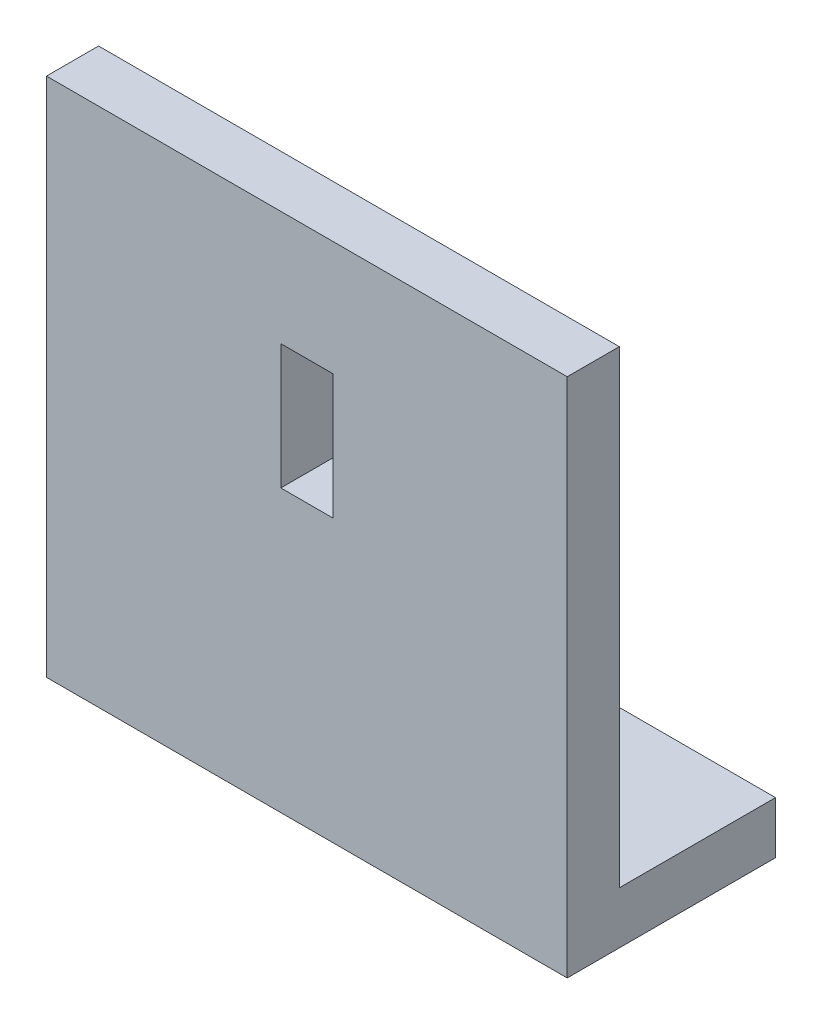
ISO-10303-21;
HEADER;
FILE_DESCRIPTION(('STEP AP214'),'2;1');
FILE_NAME('part.step','',(''),(''),'','','');
FILE_SCHEMA(('AUTOMOTIVE_DESIGN { 1 0 10303 214 1 1 1 1 }'));
ENDSEC;
DATA;
#1=APPLICATION_CONTEXT('core data for automotive mechanical design processes');
#2=APPLICATION_PROTOCOL_DEFINITION('international standard','automotive_design',2000,#1);
#3=PRODUCT_CONTEXT('',#1,'mechanical');
#4=PRODUCT('Part','Part','',(#3));
#5=PRODUCT_RELATED_PRODUCT_CATEGORY('part','',(#4));
#6=PRODUCT_DEFINITION_FORMATION('','',#4);
#7=PRODUCT_DEFINITION_CONTEXT('part definition',#1,'design');
#8=PRODUCT_DEFINITION('design','',#6,#7);
#9=PRODUCT_DEFINITION_SHAPE('','',#8);
#10=(LENGTH_UNIT() NAMED_UNIT(*) SI_UNIT(.MILLI.,.METRE.));
#11=(NAMED_UNIT(*) PLANE_ANGLE_UNIT() SI_UNIT($,.RADIAN.));
#12=(NAMED_UNIT(*) SI_UNIT($,.STERADIAN.) SOLID_ANGLE_UNIT());
#13=UNCERTAINTY_MEASURE_WITH_UNIT(LENGTH_MEASURE(1.E-05),#10,'distance_accuracy_value','');
#14=(GEOMETRIC_REPRESENTATION_CONTEXT(3) GLOBAL_UNCERTAINTY_ASSIGNED_CONTEXT((#13)) GLOBAL_UNIT_ASSIGNED_CONTEXT((#10,
#11,#12)) REPRESENTATION_CONTEXT('',''));
#15=CARTESIAN_POINT('',(0.,0.,0.));
#16=DIRECTION('',(0.,0.,1.));
#17=DIRECTION('',(1.,0.,0.));
#18=AXIS2_PLACEMENT_3D('',#15,#16,#17);
#19=CARTESIAN_POINT('',(4.99999999999367,65.9999999999885,-13.));
#20=DIRECTION('',(0.,-1.,0.));
#21=DIRECTION('',(0.,0.,-1.));
#22=AXIS2_PLACEMENT_3D('',#19,#20,#21);
#23=PLANE('',#22);
#24=DIRECTION('',(0.,0.,1.));
#25=VECTOR('',#24,1.);
#26=CARTESIAN_POINT('',(-5.00000000000633,65.9999999999885,-13.));
#27=LINE('',#26,#25);
#28=CARTESIAN_POINT('',(-5.00000000000632,65.9999999999885,-3.99999999999999));
#29=VERTEX_POINT('',#28);
#30=CARTESIAN_POINT('',(-5.00000000000633,65.9999999999885,10.));
#31=VERTEX_POINT('',#30);
#32=EDGE_CURVE('E239',#29,#31,#27,.T.);
#33=ORIENTED_EDGE('',*,*,#32,.F.);
#34=DIRECTION('',(1.,0.,0.));
#35=VECTOR('',#34,1.);
#36=CARTESIAN_POINT('',(-5.00000000000632,65.9999999999885,-3.99999999999999));
#37=LINE('',#36,#35);
#38=CARTESIAN_POINT('',(-7.00000000000633,65.9999999999885,-3.99999999999999));
#39=VERTEX_POINT('',#38);
#40=EDGE_CURVE('E351',#39,#29,#37,.T.);
#41=ORIENTED_EDGE('',*,*,#40,.F.);
#42=DIRECTION('',(0.,0.,1.));
#43=VECTOR('',#42,1.);
#44=CARTESIAN_POINT('',(-7.00000000000633,65.9999999999885,-13.));
#45=LINE('',#44,#43);
#46=CARTESIAN_POINT('',(-7.00000000000633,65.9999999999885,10.));
#47=VERTEX_POINT('',#46);
#48=EDGE_CURVE('E233',#39,#47,#45,.T.);
#49=ORIENTED_EDGE('',*,*,#48,.T.);
#50=DIRECTION('',(1.,0.,0.));
#51=VECTOR('',#50,1.);
#52=CARTESIAN_POINT('',(-7.00000000000633,65.9999999999885,10.));
#53=LINE('',#52,#51);
#54=EDGE_CURVE('E371',#47,#31,#53,.T.);
#55=ORIENTED_EDGE('',*,*,#54,.T.);
#56=EDGE_LOOP('',(#33,#41,#49,#55));
#57=FACE_BOUND('',#56,.T.);
#58=ADVANCED_FACE('F39',(#57),#23,.F.);
#59=CARTESIAN_POINT('',(-5.00000000000633,65.9999999999885,20.));
#60=DIRECTION('',(-1.,0.,0.));
#61=DIRECTION('',(0.,-1.,0.));
#62=AXIS2_PLACEMENT_3D('',#59,#60,#61);
#63=PLANE('',#62);
#64=DIRECTION('',(0.,0.,-1.));
#65=VECTOR('',#64,1.);
#66=CARTESIAN_POINT('',(-5.00000000000633,53.9999999999885,20.));
#67=LINE('',#66,#65);
#68=CARTESIAN_POINT('',(-5.00000000000633,53.9999999999885,20.));
#69=VERTEX_POINT('',#68);
#70=CARTESIAN_POINT('',(-5.00000000000632,53.9999999999885,-3.99999999999999));
#71=VERTEX_POINT('',#70);
#72=EDGE_CURVE('E133',#69,#71,#67,.T.);
#73=ORIENTED_EDGE('',*,*,#72,.T.);
#74=DIRECTION('',(0.,1.,0.));
#75=VECTOR('',#74,1.);
#76=CARTESIAN_POINT('',(-5.00000000000632,53.9999999999885,-3.99999999999999));
#77=LINE('',#76,#75);
#78=EDGE_CURVE('E360',#71,#29,#77,.T.);
#79=ORIENTED_EDGE('',*,*,#78,.T.);
#80=ORIENTED_EDGE('',*,*,#32,.T.);
#81=DIRECTION('',(0.,1.,0.));
#82=VECTOR('',#81,1.);
#83=CARTESIAN_POINT('',(-5.00000000000633,65.9999999999885,10.));
#84=LINE('',#83,#82);
#85=CARTESIAN_POINT('',(-5.00000000000633,77.9999999999885,10.));
#86=VERTEX_POINT('',#85);
#87=EDGE_CURVE('E337',#31,#86,#84,.T.);
#88=ORIENTED_EDGE('',*,*,#87,.T.);
#89=DIRECTION('',(0.,0.,-1.));
#90=VECTOR('',#89,1.);
#91=CARTESIAN_POINT('',(-5.00000000000633,77.9999999999885,20.));
#92=LINE('',#91,#90);
#93=CARTESIAN_POINT('',(-5.00000000000633,77.9999999999885,20.));
#94=VERTEX_POINT('',#93);
#95=EDGE_CURVE('E335',#94,#86,#92,.T.);
#96=ORIENTED_EDGE('',*,*,#95,.F.);
#97=DIRECTION('',(0.,1.,0.));
#98=VECTOR('',#97,1.);
#99=CARTESIAN_POINT('',(-5.00000000000633,65.9999999999885,20.));
#100=LINE('',#99,#98);
#101=EDGE_CURVE('E250',#69,#94,#100,.T.);
#102=ORIENTED_EDGE('',*,*,#101,.F.);
#103=EDGE_LOOP('',(#73,#79,#80,#88,#96,#102));
#104=FACE_BOUND('',#103,.T.);
#105=ADVANCED_FACE('F182',(#104),#63,.F.);
#106=CARTESIAN_POINT('',(4.99999999999367,53.9999999999885,20.));
#107=DIRECTION('',(0.,-1.,0.));
#108=DIRECTION('',(0.,0.,-1.));
#109=AXIS2_PLACEMENT_3D('',#106,#107,#108);
#110=PLANE('',#109);
#111=DIRECTION('',(1.,0.,0.));
#112=VECTOR('',#111,1.);
#113=CARTESIAN_POINT('',(4.99999999999367,53.9999999999885,-11.));
#114=LINE('',#113,#112);
#115=CARTESIAN_POINT('',(-7.00000000000633,53.9999999999885,-11.));
#116=VERTEX_POINT('',#115);
#117=CARTESIAN_POINT('',(4.99999999999367,53.9999999999885,-11.));
#118=VERTEX_POINT('',#117);
#119=EDGE_CURVE('E272',#116,#118,#114,.T.);
#120=ORIENTED_EDGE('',*,*,#119,.F.);
#121=DIRECTION('',(0.,0.,1.));
#122=VECTOR('',#121,1.);
#123=CARTESIAN_POINT('',(-7.00000000000633,53.9999999999885,-11.));
#124=LINE('',#123,#122);
#125=CARTESIAN_POINT('',(-7.00000000000633,53.9999999999885,-3.99999999999999));
#126=VERTEX_POINT('',#125);
#127=EDGE_CURVE('E353',#116,#126,#124,.T.);
#128=ORIENTED_EDGE('',*,*,#127,.T.);
#129=DIRECTION('',(1.,0.,0.));
#130=VECTOR('',#129,1.);
#131=CARTESIAN_POINT('',(-5.00000000000632,53.9999999999885,-3.99999999999999));
#132=LINE('',#131,#130);
#133=EDGE_CURVE('E355',#126,#71,#132,.T.);
#134=ORIENTED_EDGE('',*,*,#133,.T.);
#135=ORIENTED_EDGE('',*,*,#72,.F.);
#136=DIRECTION('',(-1.,0.,0.));
#137=VECTOR('',#136,1.);
#138=CARTESIAN_POINT('',(4.99999999999367,53.9999999999885,20.));
#139=LINE('',#138,#137);
#140=CARTESIAN_POINT('',(4.99999999999367,53.9999999999885,20.));
#141=VERTEX_POINT('',#140);
#142=EDGE_CURVE('E256',#141,#69,#139,.T.);
#143=ORIENTED_EDGE('',*,*,#142,.F.);
#144=DIRECTION('',(0.,0.,-1.));
#145=VECTOR('',#144,1.);
#146=CARTESIAN_POINT('',(4.99999999999367,53.9999999999885,20.));
#147=LINE('',#146,#145);
#148=EDGE_CURVE('E136',#141,#118,#147,.T.);
#149=ORIENTED_EDGE('',*,*,#148,.T.);
#150=EDGE_LOOP('',(#120,#128,#134,#135,#143,#149));
#151=FACE_BOUND('',#150,.T.);
#152=ADVANCED_FACE('F190',(#151),#110,.F.);
#153=CARTESIAN_POINT('',(4.99999999999367,65.9999999999885,20.));
#154=DIRECTION('',(1.,0.,0.));
#155=DIRECTION('',(0.,1.,0.));
#156=AXIS2_PLACEMENT_3D('',#153,#154,#155);
#157=PLANE('',#156);
#158=DIRECTION('',(0.,-1.,0.));
#159=VECTOR('',#158,1.);
#160=CARTESIAN_POINT('',(4.99999999999367,65.9999999999885,-11.));
#161=LINE('',#160,#159);
#162=CARTESIAN_POINT('',(4.99999999999367,65.9999999999885,-11.));
#163=VERTEX_POINT('',#162);
#164=EDGE_CURVE('E283',#163,#118,#161,.T.);
#165=ORIENTED_EDGE('',*,*,#164,.T.);
#166=ORIENTED_EDGE('',*,*,#148,.F.);
#167=DIRECTION('',(0.,-1.,0.));
#168=VECTOR('',#167,1.);
#169=CARTESIAN_POINT('',(4.99999999999367,65.9999999999885,20.));
#170=LINE('',#169,#168);
#171=CARTESIAN_POINT('',(4.99999999999367,77.9999999999885,20.));
#172=VERTEX_POINT('',#171);
#173=EDGE_CURVE('E253',#172,#141,#170,.T.);
#174=ORIENTED_EDGE('',*,*,#173,.F.);
#175=DIRECTION('',(0.,0.,-1.));
#176=VECTOR('',#175,1.);
#177=CARTESIAN_POINT('',(4.99999999999367,77.9999999999885,20.));
#178=LINE('',#177,#176);
#179=CARTESIAN_POINT('',(4.99999999999367,77.9999999999885,10.));
#180=VERTEX_POINT('',#179);
#181=EDGE_CURVE('E341',#172,#180,#178,.T.);
#182=ORIENTED_EDGE('',*,*,#181,.T.);
#183=DIRECTION('',(0.,-1.,0.));
#184=VECTOR('',#183,1.);
#185=CARTESIAN_POINT('',(4.99999999999367,65.9999999999885,10.));
#186=LINE('',#185,#184);
#187=CARTESIAN_POINT('',(4.99999999999367,65.9999999999885,10.));
#188=VERTEX_POINT('',#187);
#189=EDGE_CURVE('E348',#180,#188,#186,.T.);
#190=ORIENTED_EDGE('',*,*,#189,.T.);
#191=DIRECTION('',(0.,0.,1.));
#192=VECTOR('',#191,1.);
#193=CARTESIAN_POINT('',(4.99999999999367,65.9999999999885,-13.));
#194=LINE('',#193,#192);
#195=EDGE_CURVE('E248',#163,#188,#194,.T.);
#196=ORIENTED_EDGE('',*,*,#195,.F.);
#197=EDGE_LOOP('',(#165,#166,#174,#182,#190,#196));
#198=FACE_BOUND('',#197,.T.);
#199=ADVANCED_FACE('F279',(#198),#157,.F.);
#200=CARTESIAN_POINT('',(-50.,100.,10.));
#201=DIRECTION('',(0.,0.,1.));
#202=DIRECTION('',(1.,0.,0.));
#203=AXIS2_PLACEMENT_3D('',#200,#201,#202);
#204=PLANE('',#203);
#205=DIRECTION('',(-1.,0.,0.));
#206=VECTOR('',#205,1.);
#207=CARTESIAN_POINT('',(-50.,10.,10.));
#208=LINE('',#207,#206);
#209=CARTESIAN_POINT('',(50.,10.,10.));
#210=VERTEX_POINT('',#209);
#211=CARTESIAN_POINT('',(-50.,10.,10.));
#212=VERTEX_POINT('',#211);
#213=EDGE_CURVE('E56',#210,#212,#208,.T.);
#214=ORIENTED_EDGE('',*,*,#213,.T.);
#215=DIRECTION('',(0.,-1.,0.));
#216=VECTOR('',#215,1.);
#217=CARTESIAN_POINT('',(-50.,100.,10.));
#218=LINE('',#217,#216);
#219=CARTESIAN_POINT('',(-50.,100.,10.));
#220=VERTEX_POINT('',#219);
#221=EDGE_CURVE('E113',#220,#212,#218,.T.);
#222=ORIENTED_EDGE('',*,*,#221,.F.);
#223=DIRECTION('',(-1.,0.,0.));
#224=VECTOR('',#223,1.);
#225=CARTESIAN_POINT('',(-50.,100.,10.));
#226=LINE('',#225,#224);
#227=CARTESIAN_POINT('',(50.,100.,10.));
#228=VERTEX_POINT('',#227);
#229=EDGE_CURVE('E145',#228,#220,#226,.T.);
#230=ORIENTED_EDGE('',*,*,#229,.F.);
#231=DIRECTION('',(0.,-1.,0.));
#232=VECTOR('',#231,1.);
#233=CARTESIAN_POINT('',(50.,100.,10.));
#234=LINE('',#233,#232);
#235=EDGE_CURVE('E109',#228,#210,#234,.T.);
#236=ORIENTED_EDGE('',*,*,#235,.T.);
#237=EDGE_LOOP('',(#214,#222,#230,#236));
#238=FACE_BOUND('',#237,.T.);
#239=DIRECTION('',(1.,0.,0.));
#240=VECTOR('',#239,1.);
#241=CARTESIAN_POINT('',(4.99999999999367,65.9999999999885,10.));
#242=LINE('',#241,#240);
#243=CARTESIAN_POINT('',(6.99999999999367,65.9999999999885,10.));
#244=VERTEX_POINT('',#243);
#245=EDGE_CURVE('E368',#188,#244,#242,.T.);
#246=ORIENTED_EDGE('',*,*,#245,.F.);
#247=ORIENTED_EDGE('',*,*,#189,.F.);
#248=DIRECTION('',(1.,0.,0.));
#249=VECTOR('',#248,1.);
#250=CARTESIAN_POINT('',(4.99999999999367,77.9999999999885,10.));
#251=LINE('',#250,#249);
#252=EDGE_CURVE('E344',#86,#180,#251,.T.);
#253=ORIENTED_EDGE('',*,*,#252,.F.);
#254=ORIENTED_EDGE('',*,*,#87,.F.);
#255=ORIENTED_EDGE('',*,*,#54,.F.);
#256=DIRECTION('',(0.,1.,0.));
#257=VECTOR('',#256,1.);
#258=CARTESIAN_POINT('',(-7.00000000000633,51.9999999999885,10.));
#259=LINE('',#258,#257);
#260=CARTESIAN_POINT('',(-7.00000000000633,51.9999999999885,10.));
#261=VERTEX_POINT('',#260);
#262=EDGE_CURVE('E382',#261,#47,#259,.T.);
#263=ORIENTED_EDGE('',*,*,#262,.F.);
#264=DIRECTION('',(-1.,0.,0.));
#265=VECTOR('',#264,1.);
#266=CARTESIAN_POINT('',(6.99999999999367,51.9999999999885,10.));
#267=LINE('',#266,#265);
#268=CARTESIAN_POINT('',(6.99999999999367,51.9999999999885,10.));
#269=VERTEX_POINT('',#268);
#270=EDGE_CURVE('E380',#269,#261,#267,.T.);
#271=ORIENTED_EDGE('',*,*,#270,.F.);
#272=DIRECTION('',(0.,-1.,0.));
#273=VECTOR('',#272,1.);
#274=CARTESIAN_POINT('',(6.99999999999367,65.9999999999885,10.));
#275=LINE('',#274,#273);
#276=EDGE_CURVE('E378',#244,#269,#275,.T.);
#277=ORIENTED_EDGE('',*,*,#276,.F.);
#278=EDGE_LOOP('',(#246,#247,#253,#254,#255,#263,#271,#277));
#279=FACE_BOUND('',#278,.T.);
#280=ADVANCED_FACE('F159',(#238,#279),#204,.F.);
#281=CARTESIAN_POINT('',(50.,10.,-20.));
#282=DIRECTION('',(-1.,0.,0.));
#283=DIRECTION('',(0.,0.,1.));
#284=AXIS2_PLACEMENT_3D('',#281,#282,#283);
#285=PLANE('',#284);
#286=DIRECTION('',(0.,0.,-1.));
#287=VECTOR('',#286,1.);
#288=CARTESIAN_POINT('',(50.,0.,-20.));
#289=LINE('',#288,#287);
#290=CARTESIAN_POINT('',(50.,0.,20.));
#291=VERTEX_POINT('',#290);
#292=CARTESIAN_POINT('',(50.,0.,-20.));
#293=VERTEX_POINT('',#292);
#294=EDGE_CURVE('E101',#291,#293,#289,.T.);
#295=ORIENTED_EDGE('',*,*,#294,.T.);
#296=DIRECTION('',(0.,-1.,0.));
#297=VECTOR('',#296,1.);
#298=CARTESIAN_POINT('',(50.,10.,-20.));
#299=LINE('',#298,#297);
#300=CARTESIAN_POINT('',(50.,10.,-20.));
#301=VERTEX_POINT('',#300);
#302=EDGE_CURVE('E11',#301,#293,#299,.T.);
#303=ORIENTED_EDGE('',*,*,#302,.F.);
#304=DIRECTION('',(0.,0.,-1.));
#305=VECTOR('',#304,1.);
#306=CARTESIAN_POINT('',(50.,10.,-20.));
#307=LINE('',#306,#305);
#308=EDGE_CURVE('E94',#210,#301,#307,.T.);
#309=ORIENTED_EDGE('',*,*,#308,.F.);
#310=ORIENTED_EDGE('',*,*,#235,.F.);
#311=DIRECTION('',(0.,0.,-1.));
#312=VECTOR('',#311,1.);
#313=CARTESIAN_POINT('',(50.,100.,20.));
#314=LINE('',#313,#312);
#315=CARTESIAN_POINT('',(50.,100.,20.));
#316=VERTEX_POINT('',#315);
#317=EDGE_CURVE('E104',#316,#228,#314,.T.);
#318=ORIENTED_EDGE('',*,*,#317,.F.);
#319=DIRECTION('',(0.,-1.,0.));
#320=VECTOR('',#319,1.);
#321=CARTESIAN_POINT('',(50.,10.,20.));
#322=LINE('',#321,#320);
#323=EDGE_CURVE('E87',#316,#291,#322,.T.);
#324=ORIENTED_EDGE('',*,*,#323,.T.);
#325=EDGE_LOOP('',(#295,#303,#309,#310,#318,#324));
#326=FACE_BOUND('',#325,.T.);
#327=ADVANCED_FACE('F41',(#326),#285,.F.);
#328=CARTESIAN_POINT('',(-50.,10.,-20.));
#329=DIRECTION('',(0.,0.,1.));
#330=DIRECTION('',(1.,0.,0.));
#331=AXIS2_PLACEMENT_3D('',#328,#329,#330);
#332=PLANE('',#331);
#333=DIRECTION('',(-1.,0.,0.));
#334=VECTOR('',#333,1.);
#335=CARTESIAN_POINT('',(-50.,0.,-20.));
#336=LINE('',#335,#334);
#337=CARTESIAN_POINT('',(-50.,0.,-20.));
#338=VERTEX_POINT('',#337);
#339=EDGE_CURVE('E108',#293,#338,#336,.T.);
#340=ORIENTED_EDGE('',*,*,#339,.T.);
#341=DIRECTION('',(0.,-1.,0.));
#342=VECTOR('',#341,1.);
#343=CARTESIAN_POINT('',(-50.,10.,-20.));
#344=LINE('',#343,#342);
#345=CARTESIAN_POINT('',(-50.,10.,-20.));
#346=VERTEX_POINT('',#345);
#347=EDGE_CURVE('E48',#346,#338,#344,.T.);
#348=ORIENTED_EDGE('',*,*,#347,.F.);
#349=DIRECTION('',(-1.,0.,0.));
#350=VECTOR('',#349,1.);
#351=CARTESIAN_POINT('',(-50.,10.,-20.));
#352=LINE('',#351,#350);
#353=EDGE_CURVE('E62',#301,#346,#352,.T.);
#354=ORIENTED_EDGE('',*,*,#353,.F.);
#355=ORIENTED_EDGE('',*,*,#302,.T.);
#356=EDGE_LOOP('',(#340,#348,#354,#355));
#357=FACE_BOUND('',#356,.T.);
#358=ADVANCED_FACE('F174',(#357),#332,.F.);
#359=CARTESIAN_POINT('',(-50.,10.,-20.));
#360=DIRECTION('',(1.,0.,0.));
#361=DIRECTION('',(0.,0.,-1.));
#362=AXIS2_PLACEMENT_3D('',#359,#360,#361);
#363=PLANE('',#362);
#364=DIRECTION('',(0.,0.,1.));
#365=VECTOR('',#364,1.);
#366=CARTESIAN_POINT('',(-50.,0.,-20.));
#367=LINE('',#366,#365);
#368=CARTESIAN_POINT('',(-50.,0.,20.));
#369=VERTEX_POINT('',#368);
#370=EDGE_CURVE('E95',#338,#369,#367,.T.);
#371=ORIENTED_EDGE('',*,*,#370,.T.);
#372=DIRECTION('',(0.,-1.,0.));
#373=VECTOR('',#372,1.);
#374=CARTESIAN_POINT('',(-50.,10.,20.));
#375=LINE('',#374,#373);
#376=CARTESIAN_POINT('',(-50.,100.,20.));
#377=VERTEX_POINT('',#376);
#378=EDGE_CURVE('E90',#377,#369,#375,.T.);
#379=ORIENTED_EDGE('',*,*,#378,.F.);
#380=DIRECTION('',(0.,0.,1.));
#381=VECTOR('',#380,1.);
#382=CARTESIAN_POINT('',(-50.,100.,20.));
#383=LINE('',#382,#381);
#384=EDGE_CURVE('E139',#220,#377,#383,.T.);
#385=ORIENTED_EDGE('',*,*,#384,.F.);
#386=ORIENTED_EDGE('',*,*,#221,.T.);
#387=DIRECTION('',(0.,0.,1.));
#388=VECTOR('',#387,1.);
#389=CARTESIAN_POINT('',(-50.,10.,-20.));
#390=LINE('',#389,#388);
#391=EDGE_CURVE('E105',#346,#212,#390,.T.);
#392=ORIENTED_EDGE('',*,*,#391,.F.);
#393=ORIENTED_EDGE('',*,*,#347,.T.);
#394=EDGE_LOOP('',(#371,#379,#385,#386,#392,#393));
#395=FACE_BOUND('',#394,.T.);
#396=ADVANCED_FACE('F163',(#395),#363,.F.);
#397=CARTESIAN_POINT('',(-50.,10.,20.));
#398=DIRECTION('',(0.,0.,-1.));
#399=DIRECTION('',(-1.,0.,0.));
#400=AXIS2_PLACEMENT_3D('',#397,#398,#399);
#401=PLANE('',#400);
#402=DIRECTION('',(1.,0.,0.));
#403=VECTOR('',#402,1.);
#404=CARTESIAN_POINT('',(4.99999999999367,77.9999999999885,20.));
#405=LINE('',#404,#403);
#406=EDGE_CURVE('E333',#94,#172,#405,.T.);
#407=ORIENTED_EDGE('',*,*,#406,.T.);
#408=ORIENTED_EDGE('',*,*,#173,.T.);
#409=ORIENTED_EDGE('',*,*,#142,.T.);
#410=ORIENTED_EDGE('',*,*,#101,.T.);
#411=EDGE_LOOP('',(#407,#408,#409,#410));
#412=FACE_BOUND('',#411,.T.);
#413=DIRECTION('',(1.,0.,0.));
#414=VECTOR('',#413,1.);
#415=CARTESIAN_POINT('',(-50.,0.,20.));
#416=LINE('',#415,#414);
#417=EDGE_CURVE('E82',#369,#291,#416,.T.);
#418=ORIENTED_EDGE('',*,*,#417,.T.);
#419=ORIENTED_EDGE('',*,*,#323,.F.);
#420=DIRECTION('',(1.,0.,0.));
#421=VECTOR('',#420,1.);
#422=CARTESIAN_POINT('',(-50.,100.,20.));
#423=LINE('',#422,#421);
#424=EDGE_CURVE('E142',#377,#316,#423,.T.);
#425=ORIENTED_EDGE('',*,*,#424,.F.);
#426=ORIENTED_EDGE('',*,*,#378,.T.);
#427=EDGE_LOOP('',(#418,#419,#425,#426));
#428=FACE_BOUND('',#427,.T.);
#429=ADVANCED_FACE('F84',(#412,#428),#401,.F.);
#430=CARTESIAN_POINT('',(0.,10.,0.));
#431=DIRECTION('',(0.,1.,0.));
#432=DIRECTION('',(0.,0.,1.));
#433=AXIS2_PLACEMENT_3D('',#430,#431,#432);
#434=PLANE('',#433);
#435=CARTESIAN_POINT('',(-25.,10.,-4.99999999999999));
#436=DIRECTION('',(0.,1.,0.));
#437=DIRECTION('',(0.,0.,1.));
#438=AXIS2_PLACEMENT_3D('',#435,#436,#437);
#439=CIRCLE('',#438,2.);
#440=CARTESIAN_POINT('',(-25.,10.,-2.99999999999999));
#441=VERTEX_POINT('',#440);
#442=EDGE_CURVE('E123',#441,#441,#439,.T.);
#443=ORIENTED_EDGE('',*,*,#442,.F.);
#444=EDGE_LOOP('',(#443));
#445=FACE_BOUND('',#444,.T.);
#446=CARTESIAN_POINT('',(25.,10.,-4.99999999999999));
#447=DIRECTION('',(0.,1.,0.));
#448=DIRECTION('',(0.,0.,-1.));
#449=AXIS2_PLACEMENT_3D('',#446,#447,#448);
#450=CIRCLE('',#449,2.);
#451=CARTESIAN_POINT('',(25.,10.,-2.99999999999999));
#452=VERTEX_POINT('',#451);
#453=EDGE_CURVE('E128',#452,#452,#450,.T.);
#454=ORIENTED_EDGE('',*,*,#453,.F.);
#455=EDGE_LOOP('',(#454));
#456=FACE_BOUND('',#455,.T.);
#457=ORIENTED_EDGE('',*,*,#213,.F.);
#458=ORIENTED_EDGE('',*,*,#308,.T.);
#459=ORIENTED_EDGE('',*,*,#353,.T.);
#460=ORIENTED_EDGE('',*,*,#391,.T.);
#461=EDGE_LOOP('',(#457,#458,#459,#460));
#462=FACE_BOUND('',#461,.T.);
#463=ADVANCED_FACE('F153',(#445,#456,#462),#434,.T.);
#464=CARTESIAN_POINT('',(0.,0.,0.));
#465=DIRECTION('',(0.,1.,0.));
#466=DIRECTION('',(0.,0.,1.));
#467=AXIS2_PLACEMENT_3D('',#464,#465,#466);
#468=PLANE('',#467);
#469=CARTESIAN_POINT('',(-25.,0.,-4.99999999999999));
#470=DIRECTION('',(0.,1.,0.));
#471=DIRECTION('',(0.,0.,1.));
#472=AXIS2_PLACEMENT_3D('',#469,#470,#471);
#473=CIRCLE('',#472,2.);
#474=CARTESIAN_POINT('',(-25.,0.,-2.99999999999999));
#475=VERTEX_POINT('',#474);
#476=EDGE_CURVE('E43',#475,#475,#473,.T.);
#477=ORIENTED_EDGE('',*,*,#476,.T.);
#478=EDGE_LOOP('',(#477));
#479=FACE_BOUND('',#478,.T.);
#480=CARTESIAN_POINT('',(25.,0.,-4.99999999999999));
#481=DIRECTION('',(0.,1.,0.));
#482=DIRECTION('',(0.,0.,1.));
#483=AXIS2_PLACEMENT_3D('',#480,#481,#482);
#484=CIRCLE('',#483,2.);
#485=CARTESIAN_POINT('',(25.,0.,-2.99999999999999));
#486=VERTEX_POINT('',#485);
#487=EDGE_CURVE('E121',#486,#486,#484,.T.);
#488=ORIENTED_EDGE('',*,*,#487,.T.);
#489=EDGE_LOOP('',(#488));
#490=FACE_BOUND('',#489,.T.);
#491=ORIENTED_EDGE('',*,*,#294,.F.);
#492=ORIENTED_EDGE('',*,*,#417,.F.);
#493=ORIENTED_EDGE('',*,*,#370,.F.);
#494=ORIENTED_EDGE('',*,*,#339,.F.);
#495=EDGE_LOOP('',(#491,#492,#493,#494));
#496=FACE_BOUND('',#495,.T.);
#497=ADVANCED_FACE('F107',(#479,#490,#496),#468,.F.);
#498=CARTESIAN_POINT('',(0.,100.,0.));
#499=DIRECTION('',(0.,-1.,0.));
#500=DIRECTION('',(0.,0.,-1.));
#501=AXIS2_PLACEMENT_3D('',#498,#499,#500);
#502=PLANE('',#501);
#503=ORIENTED_EDGE('',*,*,#384,.T.);
#504=ORIENTED_EDGE('',*,*,#424,.T.);
#505=ORIENTED_EDGE('',*,*,#317,.T.);
#506=ORIENTED_EDGE('',*,*,#229,.T.);
#507=EDGE_LOOP('',(#503,#504,#505,#506));
#508=FACE_BOUND('',#507,.T.);
#509=ADVANCED_FACE('F167',(#508),#502,.F.);
#510=CARTESIAN_POINT('',(25.,-80.,-4.99999999999999));
#511=DIRECTION('',(0.,1.,0.));
#512=DIRECTION('',(0.,0.,1.));
#513=AXIS2_PLACEMENT_3D('',#510,#511,#512);
#514=CYLINDRICAL_SURFACE('',#513,2.);
#515=CARTESIAN_POINT('',(25.,10.,-2.99999999999999));
#516=CARTESIAN_POINT('',(25.,9.89583333333334,-2.99999999999999));
#517=CARTESIAN_POINT('',(25.,9.79166666666668,-2.99999999999999));
#518=CARTESIAN_POINT('',(25.,9.58333333333335,-2.99999999999999));
#519=CARTESIAN_POINT('',(25.,9.47916666666668,-2.99999999999999));
#520=CARTESIAN_POINT('',(25.,9.27083333333334,-2.99999999999999));
#521=CARTESIAN_POINT('',(25.,9.16666666666667,-2.99999999999999));
#522=CARTESIAN_POINT('',(25.,8.95833333333334,-2.99999999999999));
#523=CARTESIAN_POINT('',(25.,8.85416666666667,-2.99999999999999));
#524=CARTESIAN_POINT('',(25.,8.64583333333334,-2.99999999999999));
#525=CARTESIAN_POINT('',(25.,8.54166666666668,-2.99999999999999));
#526=CARTESIAN_POINT('',(25.,8.33333333333334,-2.99999999999999));
#527=CARTESIAN_POINT('',(25.,8.22916666666668,-2.99999999999999));
#528=CARTESIAN_POINT('',(25.,8.02083333333334,-2.99999999999999));
#529=CARTESIAN_POINT('',(25.,7.91666666666667,-2.99999999999999));
#530=CARTESIAN_POINT('',(25.,7.70833333333334,-2.99999999999999));
#531=CARTESIAN_POINT('',(25.,7.60416666666667,-2.99999999999999));
#532=CARTESIAN_POINT('',(25.,7.39583333333334,-2.99999999999999));
#533=CARTESIAN_POINT('',(25.,7.29166666666668,-2.99999999999999));
#534=CARTESIAN_POINT('',(25.,7.08333333333334,-2.99999999999999));
#535=CARTESIAN_POINT('',(25.,6.97916666666667,-2.99999999999999));
#536=CARTESIAN_POINT('',(25.,6.77083333333334,-2.99999999999999));
#537=CARTESIAN_POINT('',(25.,6.66666666666667,-2.99999999999999));
#538=CARTESIAN_POINT('',(25.,6.45833333333333,-2.99999999999999));
#539=CARTESIAN_POINT('',(25.,6.35416666666667,-2.99999999999999));
#540=CARTESIAN_POINT('',(25.,6.14583333333334,-2.99999999999999));
#541=CARTESIAN_POINT('',(25.,6.04166666666668,-2.99999999999999));
#542=CARTESIAN_POINT('',(25.,5.83333333333334,-2.99999999999999));
#543=CARTESIAN_POINT('',(25.,5.72916666666667,-2.99999999999999));
#544=CARTESIAN_POINT('',(25.,5.52083333333334,-2.99999999999999));
#545=CARTESIAN_POINT('',(25.,5.41666666666667,-2.99999999999999));
#546=CARTESIAN_POINT('',(25.,5.20833333333333,-2.99999999999999));
#547=CARTESIAN_POINT('',(25.,5.10416666666667,-2.99999999999999));
#548=CARTESIAN_POINT('',(25.,4.89583333333334,-2.99999999999999));
#549=CARTESIAN_POINT('',(25.,4.79166666666668,-2.99999999999999));
#550=CARTESIAN_POINT('',(25.,4.58333333333334,-2.99999999999999));
#551=CARTESIAN_POINT('',(25.,4.47916666666667,-2.99999999999999));
#552=CARTESIAN_POINT('',(25.,4.27083333333333,-2.99999999999999));
#553=CARTESIAN_POINT('',(25.,4.16666666666667,-2.99999999999999));
#554=CARTESIAN_POINT('',(25.,3.95833333333333,-2.99999999999999));
#555=CARTESIAN_POINT('',(25.,3.85416666666667,-2.99999999999999));
#556=CARTESIAN_POINT('',(25.,3.64583333333334,-2.99999999999999));
#557=CARTESIAN_POINT('',(25.,3.54166666666667,-2.99999999999999));
#558=CARTESIAN_POINT('',(25.,3.33333333333334,-2.99999999999999));
#559=CARTESIAN_POINT('',(25.,3.22916666666667,-2.99999999999999));
#560=CARTESIAN_POINT('',(25.,3.02083333333333,-2.99999999999999));
#561=CARTESIAN_POINT('',(25.,2.91666666666666,-2.99999999999999));
#562=CARTESIAN_POINT('',(25.,2.70833333333333,-2.99999999999999));
#563=CARTESIAN_POINT('',(25.,2.60416666666667,-2.99999999999999));
#564=CARTESIAN_POINT('',(25.,2.39583333333334,-2.99999999999999));
#565=CARTESIAN_POINT('',(25.,2.29166666666667,-2.99999999999999));
#566=CARTESIAN_POINT('',(25.,2.08333333333334,-2.99999999999999));
#567=CARTESIAN_POINT('',(25.,1.97916666666667,-2.99999999999999));
#568=CARTESIAN_POINT('',(25.,1.77083333333333,-2.99999999999999));
#569=CARTESIAN_POINT('',(25.,1.66666666666666,-2.99999999999999));
#570=CARTESIAN_POINT('',(25.,1.45833333333333,-2.99999999999999));
#571=CARTESIAN_POINT('',(25.,1.35416666666667,-2.99999999999999));
#572=CARTESIAN_POINT('',(25.,1.14583333333334,-2.99999999999999));
#573=CARTESIAN_POINT('',(25.,1.04166666666667,-2.99999999999999));
#574=CARTESIAN_POINT('',(25.,0.833333333333339,-2.99999999999999));
#575=CARTESIAN_POINT('',(25.,0.72916666666667,-2.99999999999999));
#576=CARTESIAN_POINT('',(25.,0.520833333333331,-2.99999999999999));
#577=CARTESIAN_POINT('',(25.,0.416666666666662,-2.99999999999999));
#578=CARTESIAN_POINT('',(25.,0.208333333333329,-2.99999999999999));
#579=CARTESIAN_POINT('',(25.,0.104166666666664,-2.99999999999999));
#580=CARTESIAN_POINT('',(25.,0.,-2.99999999999999));
#581=B_SPLINE_CURVE_WITH_KNOTS('',3,(#515,#516,#517,#518,#519,#520,#521,#522,#523,#524,#525,
#526,#527,#528,#529,#530,#531,#532,#533,#534,#535,#536,#537,#538,#539,#540,#541,#542,#543,#544,
#545,#546,#547,#548,#549,#550,#551,#552,#553,#554,#555,#556,#557,#558,#559,#560,#561,#562,#563,
#564,#565,#566,#567,#568,#569,#570,#571,#572,#573,#574,#575,#576,#577,#578,#579,#580),
.UNSPECIFIED.,.F.,.F.,(4,2,2,2,2,2,2,2,2,2,2,2,2,2,2,2,2,2,2,2,2,2,2,2,2,2,2,2,2,2,2,2,4),(0.,
0.312499999999993,0.625000000000001,0.937500000000008,1.25,1.56249999999999,1.875,
2.18750000000001,2.5,2.8125,3.125,3.43750000000001,3.75,4.0625,4.375,4.68750000000001,5.,5.3125,
5.62500000000001,5.93750000000001,6.25000000000001,6.5625,6.87500000000001,7.18750000000001,
7.50000000000001,7.8125,8.12500000000001,8.43750000000001,8.75000000000001,9.0625,
9.37500000000001,9.68750000000002,10.),.UNSPECIFIED.);
#582=EDGE_CURVE('BSEAM208',#452,#486,#581,.T.);
#583=ORIENTED_EDGE('',*,*,#453,.T.);
#584=ORIENTED_EDGE('',*,*,#487,.F.);
#585=ORIENTED_EDGE('',*,*,#582,.T.);
#586=ORIENTED_EDGE('',*,*,#582,.F.);
#587=EDGE_LOOP('',(#583,#585,#584,#586));
#588=FACE_BOUND('',#587,.T.);
#589=ADVANCED_FACE('F208',(#588),#514,.F.);
#590=CARTESIAN_POINT('',(-25.,-80.,-4.99999999999999));
#591=DIRECTION('',(0.,1.,0.));
#592=DIRECTION('',(0.,0.,1.));
#593=AXIS2_PLACEMENT_3D('',#590,#591,#592);
#594=CYLINDRICAL_SURFACE('',#593,2.);
#595=CARTESIAN_POINT('',(-25.,10.,-2.99999999999999));
#596=CARTESIAN_POINT('',(-25.,9.89583333333334,-2.99999999999999));
#597=CARTESIAN_POINT('',(-25.,9.79166666666668,-2.99999999999999));
#598=CARTESIAN_POINT('',(-25.,9.58333333333335,-2.99999999999999));
#599=CARTESIAN_POINT('',(-25.,9.47916666666668,-2.99999999999999));
#600=CARTESIAN_POINT('',(-25.,9.27083333333334,-2.99999999999999));
#601=CARTESIAN_POINT('',(-25.,9.16666666666667,-2.99999999999999));
#602=CARTESIAN_POINT('',(-25.,8.95833333333334,-2.99999999999999));
#603=CARTESIAN_POINT('',(-25.,8.85416666666667,-2.99999999999999));
#604=CARTESIAN_POINT('',(-25.,8.64583333333334,-2.99999999999999));
#605=CARTESIAN_POINT('',(-25.,8.54166666666668,-2.99999999999999));
#606=CARTESIAN_POINT('',(-25.,8.33333333333334,-2.99999999999999));
#607=CARTESIAN_POINT('',(-25.,8.22916666666668,-2.99999999999999));
#608=CARTESIAN_POINT('',(-25.,8.02083333333334,-2.99999999999999));
#609=CARTESIAN_POINT('',(-25.,7.91666666666667,-2.99999999999999));
#610=CARTESIAN_POINT('',(-25.,7.70833333333334,-2.99999999999999));
#611=CARTESIAN_POINT('',(-25.,7.60416666666667,-2.99999999999999));
#612=CARTESIAN_POINT('',(-25.,7.39583333333334,-2.99999999999999));
#613=CARTESIAN_POINT('',(-25.,7.29166666666668,-2.99999999999999));
#614=CARTESIAN_POINT('',(-25.,7.08333333333334,-2.99999999999999));
#615=CARTESIAN_POINT('',(-25.,6.97916666666667,-2.99999999999999));
#616=CARTESIAN_POINT('',(-25.,6.77083333333334,-2.99999999999999));
#617=CARTESIAN_POINT('',(-25.,6.66666666666667,-2.99999999999999));
#618=CARTESIAN_POINT('',(-25.,6.45833333333333,-2.99999999999999));
#619=CARTESIAN_POINT('',(-25.,6.35416666666667,-2.99999999999999));
#620=CARTESIAN_POINT('',(-25.,6.14583333333334,-2.99999999999999));
#621=CARTESIAN_POINT('',(-25.,6.04166666666668,-2.99999999999999));
#622=CARTESIAN_POINT('',(-25.,5.83333333333334,-2.99999999999999));
#623=CARTESIAN_POINT('',(-25.,5.72916666666667,-2.99999999999999));
#624=CARTESIAN_POINT('',(-25.,5.52083333333334,-2.99999999999999));
#625=CARTESIAN_POINT('',(-25.,5.41666666666667,-2.99999999999999));
#626=CARTESIAN_POINT('',(-25.,5.20833333333333,-2.99999999999999));
#627=CARTESIAN_POINT('',(-25.,5.10416666666667,-2.99999999999999));
#628=CARTESIAN_POINT('',(-25.,4.89583333333334,-2.99999999999999));
#629=CARTESIAN_POINT('',(-25.,4.79166666666668,-2.99999999999999));
#630=CARTESIAN_POINT('',(-25.,4.58333333333334,-2.99999999999999));
#631=CARTESIAN_POINT('',(-25.,4.47916666666667,-2.99999999999999));
#632=CARTESIAN_POINT('',(-25.,4.27083333333333,-2.99999999999999));
#633=CARTESIAN_POINT('',(-25.,4.16666666666667,-2.99999999999999));
#634=CARTESIAN_POINT('',(-25.,3.95833333333333,-2.99999999999999));
#635=CARTESIAN_POINT('',(-25.,3.85416666666667,-2.99999999999999));
#636=CARTESIAN_POINT('',(-25.,3.64583333333334,-2.99999999999999));
#637=CARTESIAN_POINT('',(-25.,3.54166666666667,-2.99999999999999));
#638=CARTESIAN_POINT('',(-25.,3.33333333333334,-2.99999999999999));
#639=CARTESIAN_POINT('',(-25.,3.22916666666667,-2.99999999999999));
#640=CARTESIAN_POINT('',(-25.,3.02083333333333,-2.99999999999999));
#641=CARTESIAN_POINT('',(-25.,2.91666666666666,-2.99999999999999));
#642=CARTESIAN_POINT('',(-25.,2.70833333333333,-2.99999999999999));
#643=CARTESIAN_POINT('',(-25.,2.60416666666667,-2.99999999999999));
#644=CARTESIAN_POINT('',(-25.,2.39583333333334,-2.99999999999999));
#645=CARTESIAN_POINT('',(-25.,2.29166666666667,-2.99999999999999));
#646=CARTESIAN_POINT('',(-25.,2.08333333333334,-2.99999999999999));
#647=CARTESIAN_POINT('',(-25.,1.97916666666667,-2.99999999999999));
#648=CARTESIAN_POINT('',(-25.,1.77083333333333,-2.99999999999999));
#649=CARTESIAN_POINT('',(-25.,1.66666666666666,-2.99999999999999));
#650=CARTESIAN_POINT('',(-25.,1.45833333333333,-2.99999999999999));
#651=CARTESIAN_POINT('',(-25.,1.35416666666667,-2.99999999999999));
#652=CARTESIAN_POINT('',(-25.,1.14583333333334,-2.99999999999999));
#653=CARTESIAN_POINT('',(-25.,1.04166666666667,-2.99999999999999));
#654=CARTESIAN_POINT('',(-25.,0.833333333333339,-2.99999999999999));
#655=CARTESIAN_POINT('',(-25.,0.72916666666667,-2.99999999999999));
#656=CARTESIAN_POINT('',(-25.,0.520833333333331,-2.99999999999999));
#657=CARTESIAN_POINT('',(-25.,0.416666666666662,-2.99999999999999));
#658=CARTESIAN_POINT('',(-25.,0.208333333333329,-2.99999999999999));
#659=CARTESIAN_POINT('',(-25.,0.104166666666664,-2.99999999999999));
#660=CARTESIAN_POINT('',(-25.,0.,-2.99999999999999));
#661=B_SPLINE_CURVE_WITH_KNOTS('',3,(#595,#596,#597,#598,#599,#600,#601,#602,#603,#604,#605,
#606,#607,#608,#609,#610,#611,#612,#613,#614,#615,#616,#617,#618,#619,#620,#621,#622,#623,#624,
#625,#626,#627,#628,#629,#630,#631,#632,#633,#634,#635,#636,#637,#638,#639,#640,#641,#642,#643,
#644,#645,#646,#647,#648,#649,#650,#651,#652,#653,#654,#655,#656,#657,#658,#659,#660),
.UNSPECIFIED.,.F.,.F.,(4,2,2,2,2,2,2,2,2,2,2,2,2,2,2,2,2,2,2,2,2,2,2,2,2,2,2,2,2,2,2,2,4),(0.,
0.312499999999993,0.625000000000001,0.937500000000008,1.25,1.56249999999999,1.875,
2.18750000000001,2.5,2.8125,3.125,3.43750000000001,3.75,4.0625,4.375,4.68750000000001,5.,5.3125,
5.62500000000001,5.93750000000001,6.25000000000001,6.5625,6.87500000000001,7.18750000000001,
7.50000000000001,7.8125,8.12500000000001,8.43750000000001,8.75000000000001,9.0625,
9.37500000000001,9.68750000000002,10.),.UNSPECIFIED.);
#662=EDGE_CURVE('BSEAM198',#441,#475,#661,.T.);
#663=ORIENTED_EDGE('',*,*,#442,.T.);
#664=ORIENTED_EDGE('',*,*,#476,.F.);
#665=ORIENTED_EDGE('',*,*,#662,.T.);
#666=ORIENTED_EDGE('',*,*,#662,.F.);
#667=EDGE_LOOP('',(#663,#665,#664,#666));
#668=FACE_BOUND('',#667,.T.);
#669=ADVANCED_FACE('F198',(#668),#594,.F.);
#670=CARTESIAN_POINT('',(-7.00000000000633,65.9999999999885,-13.));
#671=VERTEX_POINT('',#670);
#672=CARTESIAN_POINT('',(-7.00000000000633,65.9999999999885,-11.));
#673=VERTEX_POINT('',#672);
#674=EDGE_CURVE('E215',#671,#673,#45,.T.);
#675=ORIENTED_EDGE('',*,*,#674,.T.);
#676=DIRECTION('',(1.,0.,0.));
#677=VECTOR('',#676,1.);
#678=CARTESIAN_POINT('',(4.99999999999367,65.9999999999885,-11.));
#679=LINE('',#678,#677);
#680=EDGE_CURVE('E219',#673,#163,#679,.T.);
#681=ORIENTED_EDGE('',*,*,#680,.T.);
#682=ORIENTED_EDGE('',*,*,#195,.T.);
#683=ORIENTED_EDGE('',*,*,#245,.T.);
#684=DIRECTION('',(0.,0.,1.));
#685=VECTOR('',#684,1.);
#686=CARTESIAN_POINT('',(6.99999999999367,65.9999999999885,-13.));
#687=LINE('',#686,#685);
#688=CARTESIAN_POINT('',(6.99999999999367,65.9999999999885,-13.));
#689=VERTEX_POINT('',#688);
#690=EDGE_CURVE('E245',#689,#244,#687,.T.);
#691=ORIENTED_EDGE('',*,*,#690,.F.);
#692=DIRECTION('',(1.,0.,0.));
#693=VECTOR('',#692,1.);
#694=CARTESIAN_POINT('',(4.99999999999367,65.9999999999885,-13.));
#695=LINE('',#694,#693);
#696=EDGE_CURVE('E224',#671,#689,#695,.T.);
#697=ORIENTED_EDGE('',*,*,#696,.F.);
#698=EDGE_LOOP('',(#675,#681,#682,#683,#691,#697));
#699=FACE_BOUND('',#698,.T.);
#700=ADVANCED_FACE('F185',(#699),#23,.F.);
#701=CARTESIAN_POINT('',(6.99999999999367,65.9999999999885,-13.));
#702=DIRECTION('',(-1.,0.,0.));
#703=DIRECTION('',(0.,-1.,0.));
#704=AXIS2_PLACEMENT_3D('',#701,#702,#703);
#705=PLANE('',#704);
#706=ORIENTED_EDGE('',*,*,#276,.T.);
#707=DIRECTION('',(0.,0.,1.));
#708=VECTOR('',#707,1.);
#709=CARTESIAN_POINT('',(6.99999999999367,51.9999999999885,-13.));
#710=LINE('',#709,#708);
#711=CARTESIAN_POINT('',(6.99999999999367,51.9999999999885,-13.));
#712=VERTEX_POINT('',#711);
#713=EDGE_CURVE('E236',#712,#269,#710,.T.);
#714=ORIENTED_EDGE('',*,*,#713,.F.);
#715=DIRECTION('',(0.,-1.,0.));
#716=VECTOR('',#715,1.);
#717=CARTESIAN_POINT('',(6.99999999999367,65.9999999999885,-13.));
#718=LINE('',#717,#716);
#719=EDGE_CURVE('E370',#689,#712,#718,.T.);
#720=ORIENTED_EDGE('',*,*,#719,.F.);
#721=ORIENTED_EDGE('',*,*,#690,.T.);
#722=EDGE_LOOP('',(#706,#714,#720,#721));
#723=FACE_BOUND('',#722,.T.);
#724=ADVANCED_FACE('F197',(#723),#705,.F.);
#725=CARTESIAN_POINT('',(6.99999999999367,51.9999999999885,-13.));
#726=DIRECTION('',(0.,1.,0.));
#727=DIRECTION('',(0.,0.,1.));
#728=AXIS2_PLACEMENT_3D('',#725,#726,#727);
#729=PLANE('',#728);
#730=ORIENTED_EDGE('',*,*,#270,.T.);
#731=DIRECTION('',(0.,0.,1.));
#732=VECTOR('',#731,1.);
#733=CARTESIAN_POINT('',(-7.00000000000633,51.9999999999885,-13.));
#734=LINE('',#733,#732);
#735=CARTESIAN_POINT('',(-7.00000000000633,51.9999999999885,-13.));
#736=VERTEX_POINT('',#735);
#737=EDGE_CURVE('E232',#736,#261,#734,.T.);
#738=ORIENTED_EDGE('',*,*,#737,.F.);
#739=DIRECTION('',(-1.,0.,0.));
#740=VECTOR('',#739,1.);
#741=CARTESIAN_POINT('',(6.99999999999367,51.9999999999885,-13.));
#742=LINE('',#741,#740);
#743=EDGE_CURVE('E373',#712,#736,#742,.T.);
#744=ORIENTED_EDGE('',*,*,#743,.F.);
#745=ORIENTED_EDGE('',*,*,#713,.T.);
#746=EDGE_LOOP('',(#730,#738,#744,#745));
#747=FACE_BOUND('',#746,.T.);
#748=ADVANCED_FACE('F205',(#747),#729,.F.);
#749=CARTESIAN_POINT('',(-7.00000000000633,51.9999999999885,-13.));
#750=DIRECTION('',(1.,0.,0.));
#751=DIRECTION('',(0.,0.,-1.));
#752=AXIS2_PLACEMENT_3D('',#749,#750,#751);
#753=PLANE('',#752);
#754=ORIENTED_EDGE('',*,*,#48,.F.);
#755=DIRECTION('',(0.,1.,0.));
#756=VECTOR('',#755,1.);
#757=CARTESIAN_POINT('',(-7.00000000000633,53.9999999999885,-3.99999999999999));
#758=LINE('',#757,#756);
#759=EDGE_CURVE('E362',#126,#39,#758,.T.);
#760=ORIENTED_EDGE('',*,*,#759,.F.);
#761=ORIENTED_EDGE('',*,*,#127,.F.);
#762=DIRECTION('',(0.,1.,0.));
#763=VECTOR('',#762,1.);
#764=CARTESIAN_POINT('',(-7.00000000000633,53.9999999999885,-11.));
#765=LINE('',#764,#763);
#766=EDGE_CURVE('E358',#116,#673,#765,.T.);
#767=ORIENTED_EDGE('',*,*,#766,.T.);
#768=ORIENTED_EDGE('',*,*,#674,.F.);
#769=DIRECTION('',(0.,1.,0.));
#770=VECTOR('',#769,1.);
#771=CARTESIAN_POINT('',(-7.00000000000633,51.9999999999885,-13.));
#772=LINE('',#771,#770);
#773=EDGE_CURVE('E375',#736,#671,#772,.T.);
#774=ORIENTED_EDGE('',*,*,#773,.F.);
#775=ORIENTED_EDGE('',*,*,#737,.T.);
#776=ORIENTED_EDGE('',*,*,#262,.T.);
#777=EDGE_LOOP('',(#754,#760,#761,#767,#768,#774,#775,#776));
#778=FACE_BOUND('',#777,.T.);
#779=ADVANCED_FACE('F397',(#778),#753,.F.);
#780=CARTESIAN_POINT('',(0.,0.,-13.));
#781=DIRECTION('',(0.,0.,1.));
#782=DIRECTION('',(1.,0.,0.));
#783=AXIS2_PLACEMENT_3D('',#780,#781,#782);
#784=PLANE('',#783);
#785=ORIENTED_EDGE('',*,*,#773,.T.);
#786=ORIENTED_EDGE('',*,*,#696,.T.);
#787=ORIENTED_EDGE('',*,*,#719,.T.);
#788=ORIENTED_EDGE('',*,*,#743,.T.);
#789=EDGE_LOOP('',(#785,#786,#787,#788));
#790=FACE_BOUND('',#789,.T.);
#791=ADVANCED_FACE('F405',(#790),#784,.F.);
#792=CARTESIAN_POINT('',(4.99999999999367,65.9999999999885,-11.));
#793=DIRECTION('',(0.,0.,-1.));
#794=DIRECTION('',(-1.,0.,0.));
#795=AXIS2_PLACEMENT_3D('',#792,#793,#794);
#796=PLANE('',#795);
#797=ORIENTED_EDGE('',*,*,#119,.T.);
#798=ORIENTED_EDGE('',*,*,#164,.F.);
#799=ORIENTED_EDGE('',*,*,#680,.F.);
#800=ORIENTED_EDGE('',*,*,#766,.F.);
#801=EDGE_LOOP('',(#797,#798,#799,#800));
#802=FACE_BOUND('',#801,.T.);
#803=ADVANCED_FACE('F407',(#802),#796,.F.);
#804=CARTESIAN_POINT('',(-5.00000000000632,53.9999999999885,-3.99999999999999));
#805=DIRECTION('',(0.,0.,1.));
#806=DIRECTION('',(1.,0.,0.));
#807=AXIS2_PLACEMENT_3D('',#804,#805,#806);
#808=PLANE('',#807);
#809=ORIENTED_EDGE('',*,*,#40,.T.);
#810=ORIENTED_EDGE('',*,*,#78,.F.);
#811=ORIENTED_EDGE('',*,*,#133,.F.);
#812=ORIENTED_EDGE('',*,*,#759,.T.);
#813=EDGE_LOOP('',(#809,#810,#811,#812));
#814=FACE_BOUND('',#813,.T.);
#815=ADVANCED_FACE('F394',(#814),#808,.F.);
#816=CARTESIAN_POINT('',(4.99999999999367,77.9999999999885,20.));
#817=DIRECTION('',(0.,1.,0.));
#818=DIRECTION('',(0.,0.,1.));
#819=AXIS2_PLACEMENT_3D('',#816,#817,#818);
#820=PLANE('',#819);
#821=ORIENTED_EDGE('',*,*,#252,.T.);
#822=ORIENTED_EDGE('',*,*,#181,.F.);
#823=ORIENTED_EDGE('',*,*,#406,.F.);
#824=ORIENTED_EDGE('',*,*,#95,.T.);
#825=EDGE_LOOP('',(#821,#822,#823,#824));
#826=FACE_BOUND('',#825,.T.);
#827=ADVANCED_FACE('F343',(#826),#820,.F.);
#828=CLOSED_SHELL('',(#58,#105,#152,#199,#280,#327,#358,#396,#429,#463,#497,#509,#589,#669,#700,
#724,#748,#779,#791,#803,#815,#827));
#829=MANIFOLD_SOLID_BREP('B2',#828);
#830=ADVANCED_BREP_SHAPE_REPRESENTATION('',(#18,#829),#14);
#831=SHAPE_DEFINITION_REPRESENTATION(#9,#830);
ENDSEC;
END-ISO-10303-21;
